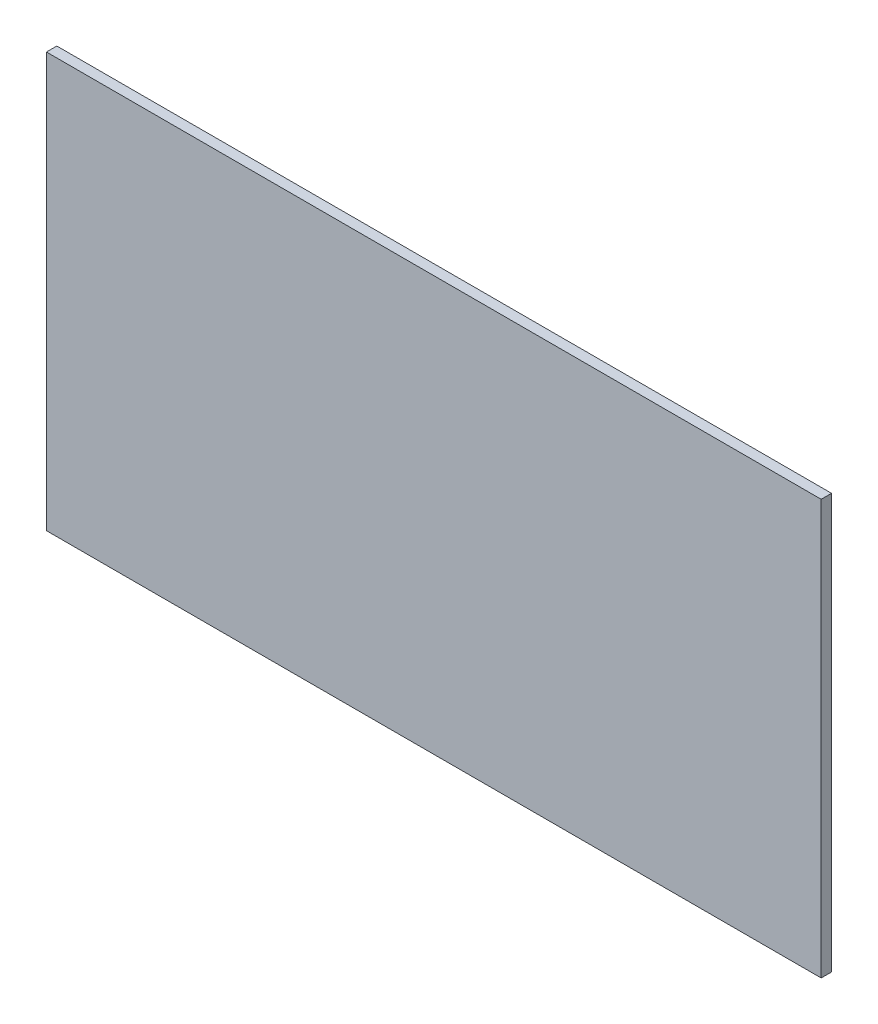
ISO-10303-21;
HEADER;
FILE_DESCRIPTION(('STEP AP214'),'2;1');
FILE_NAME('part.step','',(''),(''),'','','');
FILE_SCHEMA(('AUTOMOTIVE_DESIGN { 1 0 10303 214 1 1 1 1 }'));
ENDSEC;
DATA;
#1=APPLICATION_CONTEXT('core data for automotive mechanical design processes');
#2=APPLICATION_PROTOCOL_DEFINITION('international standard','automotive_design',2000,#1);
#3=PRODUCT_CONTEXT('',#1,'mechanical');
#4=PRODUCT('Part','Part','',(#3));
#5=PRODUCT_RELATED_PRODUCT_CATEGORY('part','',(#4));
#6=PRODUCT_DEFINITION_FORMATION('','',#4);
#7=PRODUCT_DEFINITION_CONTEXT('part definition',#1,'design');
#8=PRODUCT_DEFINITION('design','',#6,#7);
#9=PRODUCT_DEFINITION_SHAPE('','',#8);
#10=(LENGTH_UNIT() NAMED_UNIT(*) SI_UNIT(.MILLI.,.METRE.));
#11=(NAMED_UNIT(*) PLANE_ANGLE_UNIT() SI_UNIT($,.RADIAN.));
#12=(NAMED_UNIT(*) SI_UNIT($,.STERADIAN.) SOLID_ANGLE_UNIT());
#13=UNCERTAINTY_MEASURE_WITH_UNIT(LENGTH_MEASURE(1.E-05),#10,'distance_accuracy_value','');
#14=(GEOMETRIC_REPRESENTATION_CONTEXT(3) GLOBAL_UNCERTAINTY_ASSIGNED_CONTEXT((#13)) GLOBAL_UNIT_ASSIGNED_CONTEXT((#10,
#11,#12)) REPRESENTATION_CONTEXT('',''));
#15=CARTESIAN_POINT('',(0.,0.,0.));
#16=DIRECTION('',(0.,0.,1.));
#17=DIRECTION('',(1.,0.,0.));
#18=AXIS2_PLACEMENT_3D('',#15,#16,#17);
#19=CARTESIAN_POINT('',(0.,100.,0.));
#20=DIRECTION('',(1.,0.,0.));
#21=DIRECTION('',(0.,0.,-1.));
#22=AXIS2_PLACEMENT_3D('',#19,#20,#21);
#23=PLANE('',#22);
#24=DIRECTION('',(0.,0.,1.));
#25=VECTOR('',#24,1.);
#26=CARTESIAN_POINT('',(0.,0.,0.));
#27=LINE('',#26,#25);
#28=CARTESIAN_POINT('',(0.,0.,0.));
#29=VERTEX_POINT('',#28);
#30=CARTESIAN_POINT('',(0.,0.,2.5));
#31=VERTEX_POINT('',#30);
#32=EDGE_CURVE('E94',#29,#31,#27,.T.);
#33=ORIENTED_EDGE('',*,*,#32,.T.);
#34=DIRECTION('',(0.,-1.,0.));
#35=VECTOR('',#34,1.);
#36=CARTESIAN_POINT('',(0.,100.,2.5));
#37=LINE('',#36,#35);
#38=CARTESIAN_POINT('',(0.,100.,2.5));
#39=VERTEX_POINT('',#38);
#40=EDGE_CURVE('E11',#39,#31,#37,.T.);
#41=ORIENTED_EDGE('',*,*,#40,.F.);
#42=DIRECTION('',(0.,0.,1.));
#43=VECTOR('',#42,1.);
#44=CARTESIAN_POINT('',(0.,100.,0.));
#45=LINE('',#44,#43);
#46=CARTESIAN_POINT('',(0.,100.,0.));
#47=VERTEX_POINT('',#46);
#48=EDGE_CURVE('E82',#47,#39,#45,.T.);
#49=ORIENTED_EDGE('',*,*,#48,.F.);
#50=DIRECTION('',(0.,-1.,0.));
#51=VECTOR('',#50,1.);
#52=CARTESIAN_POINT('',(0.,100.,0.));
#53=LINE('',#52,#51);
#54=EDGE_CURVE('E90',#47,#29,#53,.T.);
#55=ORIENTED_EDGE('',*,*,#54,.T.);
#56=EDGE_LOOP('',(#33,#41,#49,#55));
#57=FACE_BOUND('',#56,.T.);
#58=ADVANCED_FACE('F31',(#57),#23,.F.);
#59=CARTESIAN_POINT('',(0.,100.,2.5));
#60=DIRECTION('',(0.,0.,-1.));
#61=DIRECTION('',(-1.,0.,0.));
#62=AXIS2_PLACEMENT_3D('',#59,#60,#61);
#63=PLANE('',#62);
#64=DIRECTION('',(1.,0.,0.));
#65=VECTOR('',#64,1.);
#66=CARTESIAN_POINT('',(0.,0.,2.5));
#67=LINE('',#66,#65);
#68=CARTESIAN_POINT('',(186.873025201664,0.,2.5));
#69=VERTEX_POINT('',#68);
#70=EDGE_CURVE('E86',#31,#69,#67,.T.);
#71=ORIENTED_EDGE('',*,*,#70,.T.);
#72=DIRECTION('',(0.,-1.,0.));
#73=VECTOR('',#72,1.);
#74=CARTESIAN_POINT('',(186.873025201664,100.,2.5));
#75=LINE('',#74,#73);
#76=CARTESIAN_POINT('',(186.873025201664,100.,2.5));
#77=VERTEX_POINT('',#76);
#78=EDGE_CURVE('E39',#77,#69,#75,.T.);
#79=ORIENTED_EDGE('',*,*,#78,.F.);
#80=DIRECTION('',(1.,0.,0.));
#81=VECTOR('',#80,1.);
#82=CARTESIAN_POINT('',(0.,100.,2.5));
#83=LINE('',#82,#81);
#84=EDGE_CURVE('E77',#39,#77,#83,.T.);
#85=ORIENTED_EDGE('',*,*,#84,.F.);
#86=ORIENTED_EDGE('',*,*,#40,.T.);
#87=EDGE_LOOP('',(#71,#79,#85,#86));
#88=FACE_BOUND('',#87,.T.);
#89=ADVANCED_FACE('F85',(#88),#63,.F.);
#90=CARTESIAN_POINT('',(186.873025201664,100.,0.));
#91=DIRECTION('',(-1.,0.,0.));
#92=DIRECTION('',(0.,0.,1.));
#93=AXIS2_PLACEMENT_3D('',#90,#91,#92);
#94=PLANE('',#93);
#95=DIRECTION('',(0.,0.,-1.));
#96=VECTOR('',#95,1.);
#97=CARTESIAN_POINT('',(186.873025201664,0.,0.));
#98=LINE('',#97,#96);
#99=CARTESIAN_POINT('',(186.873025201664,0.,0.));
#100=VERTEX_POINT('',#99);
#101=EDGE_CURVE('E64',#69,#100,#98,.T.);
#102=ORIENTED_EDGE('',*,*,#101,.T.);
#103=DIRECTION('',(0.,-1.,0.));
#104=VECTOR('',#103,1.);
#105=CARTESIAN_POINT('',(186.873025201664,100.,0.));
#106=LINE('',#105,#104);
#107=CARTESIAN_POINT('',(186.873025201664,100.,0.));
#108=VERTEX_POINT('',#107);
#109=EDGE_CURVE('E87',#108,#100,#106,.T.);
#110=ORIENTED_EDGE('',*,*,#109,.F.);
#111=DIRECTION('',(0.,0.,-1.));
#112=VECTOR('',#111,1.);
#113=CARTESIAN_POINT('',(186.873025201664,100.,0.));
#114=LINE('',#113,#112);
#115=EDGE_CURVE('E80',#77,#108,#114,.T.);
#116=ORIENTED_EDGE('',*,*,#115,.F.);
#117=ORIENTED_EDGE('',*,*,#78,.T.);
#118=EDGE_LOOP('',(#102,#110,#116,#117));
#119=FACE_BOUND('',#118,.T.);
#120=ADVANCED_FACE('F88',(#119),#94,.F.);
#121=CARTESIAN_POINT('',(0.,100.,0.));
#122=DIRECTION('',(0.,0.,1.));
#123=DIRECTION('',(1.,0.,0.));
#124=AXIS2_PLACEMENT_3D('',#121,#122,#123);
#125=PLANE('',#124);
#126=DIRECTION('',(-1.,0.,0.));
#127=VECTOR('',#126,1.);
#128=CARTESIAN_POINT('',(0.,0.,0.));
#129=LINE('',#128,#127);
#130=EDGE_CURVE('E70',#100,#29,#129,.T.);
#131=ORIENTED_EDGE('',*,*,#130,.T.);
#132=ORIENTED_EDGE('',*,*,#54,.F.);
#133=DIRECTION('',(-1.,0.,0.));
#134=VECTOR('',#133,1.);
#135=CARTESIAN_POINT('',(0.,100.,0.));
#136=LINE('',#135,#134);
#137=EDGE_CURVE('E47',#108,#47,#136,.T.);
#138=ORIENTED_EDGE('',*,*,#137,.F.);
#139=ORIENTED_EDGE('',*,*,#109,.T.);
#140=EDGE_LOOP('',(#131,#132,#138,#139));
#141=FACE_BOUND('',#140,.T.);
#142=ADVANCED_FACE('F101',(#141),#125,.F.);
#143=CARTESIAN_POINT('',(0.,100.,2.5));
#144=DIRECTION('',(0.,1.,0.));
#145=DIRECTION('',(0.,0.,1.));
#146=AXIS2_PLACEMENT_3D('',#143,#144,#145);
#147=PLANE('',#146);
#148=ORIENTED_EDGE('',*,*,#48,.T.);
#149=ORIENTED_EDGE('',*,*,#84,.T.);
#150=ORIENTED_EDGE('',*,*,#115,.T.);
#151=ORIENTED_EDGE('',*,*,#137,.T.);
#152=EDGE_LOOP('',(#148,#149,#150,#151));
#153=FACE_BOUND('',#152,.T.);
#154=ADVANCED_FACE('F78',(#153),#147,.T.);
#155=CARTESIAN_POINT('',(0.,0.,2.5));
#156=DIRECTION('',(0.,1.,0.));
#157=DIRECTION('',(0.,0.,1.));
#158=AXIS2_PLACEMENT_3D('',#155,#156,#157);
#159=PLANE('',#158);
#160=ORIENTED_EDGE('',*,*,#32,.F.);
#161=ORIENTED_EDGE('',*,*,#130,.F.);
#162=ORIENTED_EDGE('',*,*,#101,.F.);
#163=ORIENTED_EDGE('',*,*,#70,.F.);
#164=EDGE_LOOP('',(#160,#161,#162,#163));
#165=FACE_BOUND('',#164,.T.);
#166=ADVANCED_FACE('F104',(#165),#159,.F.);
#167=CLOSED_SHELL('',(#58,#89,#120,#142,#154,#166));
#168=MANIFOLD_SOLID_BREP('B2',#167);
#169=ADVANCED_BREP_SHAPE_REPRESENTATION('',(#18,#168),#14);
#170=SHAPE_DEFINITION_REPRESENTATION(#9,#169);
ENDSEC;
END-ISO-10303-21;
